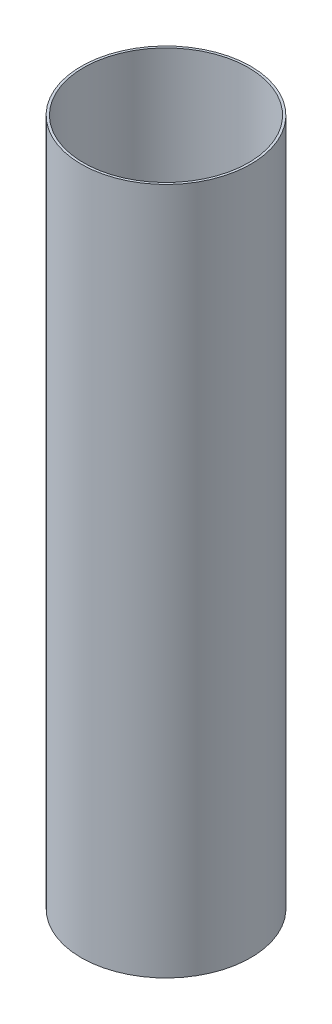
ISO-10303-21;
HEADER;
FILE_DESCRIPTION(('STEP AP214'),'2;1');
FILE_NAME('part.step','',(''),(''),'','','');
FILE_SCHEMA(('AUTOMOTIVE_DESIGN { 1 0 10303 214 1 1 1 1 }'));
ENDSEC;
DATA;
#1=APPLICATION_CONTEXT('core data for automotive mechanical design processes');
#2=APPLICATION_PROTOCOL_DEFINITION('international standard','automotive_design',2000,#1);
#3=PRODUCT_CONTEXT('',#1,'mechanical');
#4=PRODUCT('Part','Part','',(#3));
#5=PRODUCT_RELATED_PRODUCT_CATEGORY('part','',(#4));
#6=PRODUCT_DEFINITION_FORMATION('','',#4);
#7=PRODUCT_DEFINITION_CONTEXT('part definition',#1,'design');
#8=PRODUCT_DEFINITION('design','',#6,#7);
#9=PRODUCT_DEFINITION_SHAPE('','',#8);
#10=(LENGTH_UNIT() NAMED_UNIT(*) SI_UNIT(.MILLI.,.METRE.));
#11=(NAMED_UNIT(*) PLANE_ANGLE_UNIT() SI_UNIT($,.RADIAN.));
#12=(NAMED_UNIT(*) SI_UNIT($,.STERADIAN.) SOLID_ANGLE_UNIT());
#13=UNCERTAINTY_MEASURE_WITH_UNIT(LENGTH_MEASURE(1.E-05),#10,'distance_accuracy_value','');
#14=(GEOMETRIC_REPRESENTATION_CONTEXT(3) GLOBAL_UNCERTAINTY_ASSIGNED_CONTEXT((#13)) GLOBAL_UNIT_ASSIGNED_CONTEXT((#10,
#11,#12)) REPRESENTATION_CONTEXT('',''));
#15=CARTESIAN_POINT('',(0.,0.,0.));
#16=DIRECTION('',(0.,0.,1.));
#17=DIRECTION('',(1.,0.,0.));
#18=AXIS2_PLACEMENT_3D('',#15,#16,#17);
#19=CARTESIAN_POINT('',(0.,635.,0.));
#20=DIRECTION('',(0.,1.,0.));
#21=DIRECTION('',(0.,0.,1.));
#22=AXIS2_PLACEMENT_3D('',#19,#20,#21);
#23=PLANE('',#22);
#24=CARTESIAN_POINT('',(0.,635.,0.));
#25=DIRECTION('',(0.,1.,0.));
#26=DIRECTION('',(0.,0.,1.));
#27=AXIS2_PLACEMENT_3D('',#24,#25,#26);
#28=CIRCLE('',#27,78.359);
#29=CARTESIAN_POINT('',(0.,635.,-78.359));
#30=VERTEX_POINT('',#29);
#31=EDGE_CURVE('E10',#30,#30,#28,.T.);
#32=ORIENTED_EDGE('',*,*,#31,.T.);
#33=EDGE_LOOP('',(#32));
#34=FACE_BOUND('',#33,.T.);
#35=CARTESIAN_POINT('',(0.,635.,0.));
#36=DIRECTION('',(0.,1.,0.));
#37=DIRECTION('',(0.,0.,1.));
#38=AXIS2_PLACEMENT_3D('',#35,#36,#37);
#39=CIRCLE('',#38,76.2);
#40=CARTESIAN_POINT('',(0.,635.,-76.2));
#41=VERTEX_POINT('',#40);
#42=EDGE_CURVE('E50',#41,#41,#39,.T.);
#43=ORIENTED_EDGE('',*,*,#42,.F.);
#44=EDGE_LOOP('',(#43));
#45=FACE_BOUND('',#44,.T.);
#46=ADVANCED_FACE('F39',(#34,#45),#23,.T.);
#47=CARTESIAN_POINT('',(0.,0.,0.));
#48=DIRECTION('',(0.,1.,0.));
#49=DIRECTION('',(0.,0.,1.));
#50=AXIS2_PLACEMENT_3D('',#47,#48,#49);
#51=PLANE('',#50);
#52=CARTESIAN_POINT('',(0.,0.,0.));
#53=DIRECTION('',(0.,1.,0.));
#54=DIRECTION('',(0.,0.,1.));
#55=AXIS2_PLACEMENT_3D('',#52,#53,#54);
#56=CIRCLE('',#55,78.359);
#57=CARTESIAN_POINT('',(0.,-1.11022302462516E-13,-78.359));
#58=VERTEX_POINT('',#57);
#59=EDGE_CURVE('E43',#58,#58,#56,.T.);
#60=ORIENTED_EDGE('',*,*,#59,.F.);
#61=EDGE_LOOP('',(#60));
#62=FACE_BOUND('',#61,.T.);
#63=CARTESIAN_POINT('',(0.,0.,0.));
#64=DIRECTION('',(0.,1.,0.));
#65=DIRECTION('',(0.,0.,1.));
#66=AXIS2_PLACEMENT_3D('',#63,#64,#65);
#67=CIRCLE('',#66,76.2);
#68=CARTESIAN_POINT('',(0.,-1.11022302462516E-13,-76.2));
#69=VERTEX_POINT('',#68);
#70=EDGE_CURVE('E52',#69,#69,#67,.T.);
#71=ORIENTED_EDGE('',*,*,#70,.T.);
#72=EDGE_LOOP('',(#71));
#73=FACE_BOUND('',#72,.T.);
#74=ADVANCED_FACE('F62',(#62,#73),#51,.F.);
#75=CARTESIAN_POINT('',(0.,635.,0.));
#76=DIRECTION('',(0.,-1.,0.));
#77=DIRECTION('',(0.,0.,-1.));
#78=AXIS2_PLACEMENT_3D('',#75,#76,#77);
#79=CYLINDRICAL_SURFACE('',#78,78.359);
#80=CARTESIAN_POINT('',(0.,635.,-78.359));
#81=CARTESIAN_POINT('',(0.,628.385416666667,-78.359));
#82=CARTESIAN_POINT('',(0.,621.770833333333,-78.359));
#83=CARTESIAN_POINT('',(0.,608.541666666667,-78.359));
#84=CARTESIAN_POINT('',(0.,601.927083333333,-78.359));
#85=CARTESIAN_POINT('',(0.,588.697916666667,-78.359));
#86=CARTESIAN_POINT('',(0.,582.083333333333,-78.359));
#87=CARTESIAN_POINT('',(0.,568.854166666667,-78.359));
#88=CARTESIAN_POINT('',(0.,562.239583333333,-78.359));
#89=CARTESIAN_POINT('',(0.,549.010416666667,-78.359));
#90=CARTESIAN_POINT('',(0.,542.395833333333,-78.359));
#91=CARTESIAN_POINT('',(0.,529.166666666667,-78.359));
#92=CARTESIAN_POINT('',(0.,522.552083333333,-78.359));
#93=CARTESIAN_POINT('',(0.,509.322916666667,-78.359));
#94=CARTESIAN_POINT('',(0.,502.708333333333,-78.359));
#95=CARTESIAN_POINT('',(0.,489.479166666667,-78.359));
#96=CARTESIAN_POINT('',(0.,482.864583333333,-78.359));
#97=CARTESIAN_POINT('',(0.,469.635416666667,-78.359));
#98=CARTESIAN_POINT('',(0.,463.020833333333,-78.359));
#99=CARTESIAN_POINT('',(0.,449.791666666667,-78.359));
#100=CARTESIAN_POINT('',(0.,443.177083333333,-78.359));
#101=CARTESIAN_POINT('',(0.,429.947916666667,-78.359));
#102=CARTESIAN_POINT('',(0.,423.333333333333,-78.359));
#103=CARTESIAN_POINT('',(0.,410.104166666667,-78.359));
#104=CARTESIAN_POINT('',(0.,403.489583333333,-78.359));
#105=CARTESIAN_POINT('',(0.,390.260416666667,-78.359));
#106=CARTESIAN_POINT('',(0.,383.645833333333,-78.359));
#107=CARTESIAN_POINT('',(0.,370.416666666667,-78.359));
#108=CARTESIAN_POINT('',(0.,363.802083333333,-78.359));
#109=CARTESIAN_POINT('',(0.,350.572916666667,-78.359));
#110=CARTESIAN_POINT('',(0.,343.958333333333,-78.359));
#111=CARTESIAN_POINT('',(0.,330.729166666667,-78.359));
#112=CARTESIAN_POINT('',(0.,324.114583333333,-78.359));
#113=CARTESIAN_POINT('',(0.,310.885416666667,-78.359));
#114=CARTESIAN_POINT('',(0.,304.270833333333,-78.359));
#115=CARTESIAN_POINT('',(0.,291.041666666667,-78.359));
#116=CARTESIAN_POINT('',(0.,284.427083333333,-78.359));
#117=CARTESIAN_POINT('',(0.,271.197916666667,-78.359));
#118=CARTESIAN_POINT('',(0.,264.583333333333,-78.359));
#119=CARTESIAN_POINT('',(0.,251.354166666667,-78.359));
#120=CARTESIAN_POINT('',(0.,244.739583333333,-78.359));
#121=CARTESIAN_POINT('',(0.,231.510416666667,-78.359));
#122=CARTESIAN_POINT('',(0.,224.895833333333,-78.359));
#123=CARTESIAN_POINT('',(0.,211.666666666667,-78.359));
#124=CARTESIAN_POINT('',(0.,205.052083333333,-78.359));
#125=CARTESIAN_POINT('',(0.,191.822916666666,-78.359));
#126=CARTESIAN_POINT('',(0.,185.208333333333,-78.359));
#127=CARTESIAN_POINT('',(0.,171.979166666666,-78.359));
#128=CARTESIAN_POINT('',(0.,165.364583333333,-78.359));
#129=CARTESIAN_POINT('',(0.,152.135416666666,-78.359));
#130=CARTESIAN_POINT('',(0.,145.520833333333,-78.359));
#131=CARTESIAN_POINT('',(0.,132.291666666667,-78.359));
#132=CARTESIAN_POINT('',(0.,125.677083333333,-78.359));
#133=CARTESIAN_POINT('',(0.,112.447916666667,-78.359));
#134=CARTESIAN_POINT('',(0.,105.833333333333,-78.359));
#135=CARTESIAN_POINT('',(0.,92.6041666666666,-78.359));
#136=CARTESIAN_POINT('',(0.,85.9895833333332,-78.359));
#137=CARTESIAN_POINT('',(0.,72.7604166666665,-78.359));
#138=CARTESIAN_POINT('',(0.,66.1458333333332,-78.359));
#139=CARTESIAN_POINT('',(0.,52.9166666666666,-78.359));
#140=CARTESIAN_POINT('',(0.,46.3020833333332,-78.359));
#141=CARTESIAN_POINT('',(0.,33.0729166666666,-78.359));
#142=CARTESIAN_POINT('',(0.,26.4583333333333,-78.359));
#143=CARTESIAN_POINT('',(0.,13.2291666666666,-78.359));
#144=CARTESIAN_POINT('',(0.,6.61458333333324,-78.359));
#145=CARTESIAN_POINT('',(0.,-1.11022302462516E-13,-78.359));
#146=B_SPLINE_CURVE_WITH_KNOTS('',3,(#80,#81,#82,#83,#84,#85,#86,#87,#88,#89,#90,#91,#92,#93,
#94,#95,#96,#97,#98,#99,#100,#101,#102,#103,#104,#105,#106,#107,#108,#109,#110,#111,#112,#113,
#114,#115,#116,#117,#118,#119,#120,#121,#122,#123,#124,#125,#126,#127,#128,#129,#130,#131,#132,
#133,#134,#135,#136,#137,#138,#139,#140,#141,#142,#143,#144,#145),.UNSPECIFIED.,.F.,.F.,(4,2,2,
2,2,2,2,2,2,2,2,2,2,2,2,2,2,2,2,2,2,2,2,2,2,2,2,2,2,2,2,2,4),(0.,19.84375,39.6875000000001,
59.53125,79.3750000000001,99.2187500000001,119.0625,138.90625,158.75,178.59375,198.4375,
218.28125,238.125,257.96875,277.8125,297.65625,317.5,337.34375,357.1875,377.03125,396.875,
416.71875,436.5625,456.40625,476.25,496.09375,515.9375,535.78125,555.625,575.46875,595.3125,
615.15625,635.),.UNSPECIFIED.);
#147=EDGE_CURVE('BSEAM41',#30,#58,#146,.T.);
#148=ORIENTED_EDGE('',*,*,#31,.F.);
#149=ORIENTED_EDGE('',*,*,#59,.T.);
#150=ORIENTED_EDGE('',*,*,#147,.T.);
#151=ORIENTED_EDGE('',*,*,#147,.F.);
#152=EDGE_LOOP('',(#148,#150,#149,#151));
#153=FACE_BOUND('',#152,.T.);
#154=ADVANCED_FACE('F41',(#153),#79,.T.);
#155=CARTESIAN_POINT('',(0.,635.,0.));
#156=DIRECTION('',(0.,-1.,0.));
#157=DIRECTION('',(0.,0.,-1.));
#158=AXIS2_PLACEMENT_3D('',#155,#156,#157);
#159=CYLINDRICAL_SURFACE('',#158,76.2);
#160=CARTESIAN_POINT('',(0.,635.,-76.2));
#161=CARTESIAN_POINT('',(0.,628.385416666667,-76.2));
#162=CARTESIAN_POINT('',(0.,621.770833333333,-76.2));
#163=CARTESIAN_POINT('',(0.,608.541666666667,-76.2));
#164=CARTESIAN_POINT('',(0.,601.927083333333,-76.2));
#165=CARTESIAN_POINT('',(0.,588.697916666667,-76.2));
#166=CARTESIAN_POINT('',(0.,582.083333333333,-76.2));
#167=CARTESIAN_POINT('',(0.,568.854166666667,-76.2));
#168=CARTESIAN_POINT('',(0.,562.239583333333,-76.2));
#169=CARTESIAN_POINT('',(0.,549.010416666667,-76.2));
#170=CARTESIAN_POINT('',(0.,542.395833333333,-76.2));
#171=CARTESIAN_POINT('',(0.,529.166666666667,-76.2));
#172=CARTESIAN_POINT('',(0.,522.552083333333,-76.2));
#173=CARTESIAN_POINT('',(0.,509.322916666667,-76.2));
#174=CARTESIAN_POINT('',(0.,502.708333333333,-76.2));
#175=CARTESIAN_POINT('',(0.,489.479166666667,-76.2));
#176=CARTESIAN_POINT('',(0.,482.864583333333,-76.2));
#177=CARTESIAN_POINT('',(0.,469.635416666667,-76.2));
#178=CARTESIAN_POINT('',(0.,463.020833333333,-76.2));
#179=CARTESIAN_POINT('',(0.,449.791666666667,-76.2));
#180=CARTESIAN_POINT('',(0.,443.177083333333,-76.2));
#181=CARTESIAN_POINT('',(0.,429.947916666667,-76.2));
#182=CARTESIAN_POINT('',(0.,423.333333333333,-76.2));
#183=CARTESIAN_POINT('',(0.,410.104166666667,-76.2));
#184=CARTESIAN_POINT('',(0.,403.489583333333,-76.2));
#185=CARTESIAN_POINT('',(0.,390.260416666667,-76.2));
#186=CARTESIAN_POINT('',(0.,383.645833333333,-76.2));
#187=CARTESIAN_POINT('',(0.,370.416666666667,-76.2));
#188=CARTESIAN_POINT('',(0.,363.802083333333,-76.2));
#189=CARTESIAN_POINT('',(0.,350.572916666667,-76.2));
#190=CARTESIAN_POINT('',(0.,343.958333333333,-76.2));
#191=CARTESIAN_POINT('',(0.,330.729166666667,-76.2));
#192=CARTESIAN_POINT('',(0.,324.114583333333,-76.2));
#193=CARTESIAN_POINT('',(0.,310.885416666667,-76.2));
#194=CARTESIAN_POINT('',(0.,304.270833333333,-76.2));
#195=CARTESIAN_POINT('',(0.,291.041666666667,-76.2));
#196=CARTESIAN_POINT('',(0.,284.427083333333,-76.2));
#197=CARTESIAN_POINT('',(0.,271.197916666667,-76.2));
#198=CARTESIAN_POINT('',(0.,264.583333333333,-76.2));
#199=CARTESIAN_POINT('',(0.,251.354166666667,-76.2));
#200=CARTESIAN_POINT('',(0.,244.739583333333,-76.2));
#201=CARTESIAN_POINT('',(0.,231.510416666667,-76.2));
#202=CARTESIAN_POINT('',(0.,224.895833333333,-76.2));
#203=CARTESIAN_POINT('',(0.,211.666666666667,-76.2));
#204=CARTESIAN_POINT('',(0.,205.052083333333,-76.2));
#205=CARTESIAN_POINT('',(0.,191.822916666666,-76.2));
#206=CARTESIAN_POINT('',(0.,185.208333333333,-76.2));
#207=CARTESIAN_POINT('',(0.,171.979166666666,-76.2));
#208=CARTESIAN_POINT('',(0.,165.364583333333,-76.2));
#209=CARTESIAN_POINT('',(0.,152.135416666666,-76.2));
#210=CARTESIAN_POINT('',(0.,145.520833333333,-76.2));
#211=CARTESIAN_POINT('',(0.,132.291666666667,-76.2));
#212=CARTESIAN_POINT('',(0.,125.677083333333,-76.2));
#213=CARTESIAN_POINT('',(0.,112.447916666667,-76.2));
#214=CARTESIAN_POINT('',(0.,105.833333333333,-76.2));
#215=CARTESIAN_POINT('',(0.,92.6041666666666,-76.2));
#216=CARTESIAN_POINT('',(0.,85.9895833333332,-76.2));
#217=CARTESIAN_POINT('',(0.,72.7604166666665,-76.2));
#218=CARTESIAN_POINT('',(0.,66.1458333333332,-76.2));
#219=CARTESIAN_POINT('',(0.,52.9166666666666,-76.2));
#220=CARTESIAN_POINT('',(0.,46.3020833333332,-76.2));
#221=CARTESIAN_POINT('',(0.,33.0729166666666,-76.2));
#222=CARTESIAN_POINT('',(0.,26.4583333333333,-76.2));
#223=CARTESIAN_POINT('',(0.,13.2291666666666,-76.2));
#224=CARTESIAN_POINT('',(0.,6.61458333333324,-76.2));
#225=CARTESIAN_POINT('',(0.,-1.11022302462516E-13,-76.2));
#226=B_SPLINE_CURVE_WITH_KNOTS('',3,(#160,#161,#162,#163,#164,#165,#166,#167,#168,#169,#170,
#171,#172,#173,#174,#175,#176,#177,#178,#179,#180,#181,#182,#183,#184,#185,#186,#187,#188,#189,
#190,#191,#192,#193,#194,#195,#196,#197,#198,#199,#200,#201,#202,#203,#204,#205,#206,#207,#208,
#209,#210,#211,#212,#213,#214,#215,#216,#217,#218,#219,#220,#221,#222,#223,#224,#225),
.UNSPECIFIED.,.F.,.F.,(4,2,2,2,2,2,2,2,2,2,2,2,2,2,2,2,2,2,2,2,2,2,2,2,2,2,2,2,2,2,2,2,4),(0.,
19.84375,39.6875000000001,59.53125,79.3750000000001,99.2187500000001,119.0625,138.90625,158.75,
178.59375,198.4375,218.28125,238.125,257.96875,277.8125,297.65625,317.5,337.34375,357.1875,
377.03125,396.875,416.71875,436.5625,456.40625,476.25,496.09375,515.9375,535.78125,555.625,
575.46875,595.3125,615.15625,635.),.UNSPECIFIED.);
#227=EDGE_CURVE('BSEAM58',#41,#69,#226,.T.);
#228=ORIENTED_EDGE('',*,*,#42,.T.);
#229=ORIENTED_EDGE('',*,*,#70,.F.);
#230=ORIENTED_EDGE('',*,*,#227,.T.);
#231=ORIENTED_EDGE('',*,*,#227,.F.);
#232=EDGE_LOOP('',(#228,#230,#229,#231));
#233=FACE_BOUND('',#232,.T.);
#234=ADVANCED_FACE('F58',(#233),#159,.F.);
#235=CLOSED_SHELL('',(#46,#74,#154,#234));
#236=MANIFOLD_SOLID_BREP('B2',#235);
#237=ADVANCED_BREP_SHAPE_REPRESENTATION('',(#18,#236),#14);
#238=SHAPE_DEFINITION_REPRESENTATION(#9,#237);
ENDSEC;
END-ISO-10303-21;
